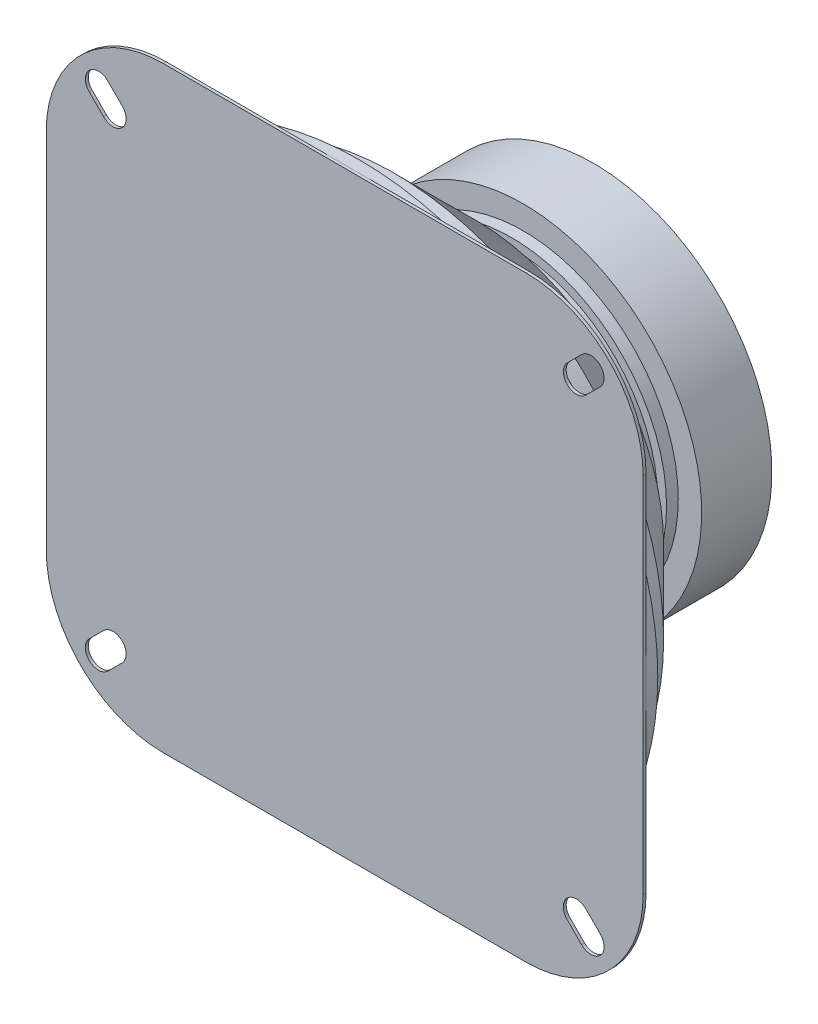
ISO-10303-21;
HEADER;
FILE_DESCRIPTION(('STEP AP214'),'2;1');
FILE_NAME('part.step','',(''),(''),'','','');
FILE_SCHEMA(('AUTOMOTIVE_DESIGN { 1 0 10303 214 1 1 1 1 }'));
ENDSEC;
DATA;
#1=APPLICATION_CONTEXT('core data for automotive mechanical design processes');
#2=APPLICATION_PROTOCOL_DEFINITION('international standard','automotive_design',2000,#1);
#3=PRODUCT_CONTEXT('',#1,'mechanical');
#4=PRODUCT('Part','Part','',(#3));
#5=PRODUCT_RELATED_PRODUCT_CATEGORY('part','',(#4));
#6=PRODUCT_DEFINITION_FORMATION('','',#4);
#7=PRODUCT_DEFINITION_CONTEXT('part definition',#1,'design');
#8=PRODUCT_DEFINITION('design','',#6,#7);
#9=PRODUCT_DEFINITION_SHAPE('','',#8);
#10=(LENGTH_UNIT() NAMED_UNIT(*) SI_UNIT(.MILLI.,.METRE.));
#11=(NAMED_UNIT(*) PLANE_ANGLE_UNIT() SI_UNIT($,.RADIAN.));
#12=(NAMED_UNIT(*) SI_UNIT($,.STERADIAN.) SOLID_ANGLE_UNIT());
#13=UNCERTAINTY_MEASURE_WITH_UNIT(LENGTH_MEASURE(1.E-05),#10,'distance_accuracy_value','');
#14=(GEOMETRIC_REPRESENTATION_CONTEXT(3) GLOBAL_UNCERTAINTY_ASSIGNED_CONTEXT((#13)) GLOBAL_UNIT_ASSIGNED_CONTEXT((#10,
#11,#12)) REPRESENTATION_CONTEXT('',''));
#15=CARTESIAN_POINT('',(0.,0.,0.));
#16=DIRECTION('',(0.,0.,1.));
#17=DIRECTION('',(1.,0.,0.));
#18=AXIS2_PLACEMENT_3D('',#15,#16,#17);
#19=CARTESIAN_POINT('',(0.,0.,14.));
#20=DIRECTION('',(0.,0.,-1.));
#21=DIRECTION('',(-1.,0.,0.));
#22=AXIS2_PLACEMENT_3D('',#19,#20,#21);
#23=CYLINDRICAL_SURFACE('',#22,30.5);
#24=CARTESIAN_POINT('',(0.,0.,14.));
#25=DIRECTION('',(0.,0.,-1.));
#26=DIRECTION('',(-1.,0.,0.));
#27=AXIS2_PLACEMENT_3D('',#24,#25,#26);
#28=CIRCLE('',#27,30.5);
#29=CARTESIAN_POINT('',(-30.5,0.,14.));
#30=VERTEX_POINT('',#29);
#31=EDGE_CURVE('E11',#30,#30,#28,.T.);
#32=ORIENTED_EDGE('',*,*,#31,.T.);
#33=EDGE_LOOP('',(#32));
#34=FACE_BOUND('',#33,.T.);
#35=CARTESIAN_POINT('',(0.,0.,2.));
#36=DIRECTION('',(0.,0.,-1.));
#37=DIRECTION('',(-1.,0.,0.));
#38=AXIS2_PLACEMENT_3D('',#35,#36,#37);
#39=CIRCLE('',#38,30.5);
#40=CARTESIAN_POINT('',(-30.5,0.,2.));
#41=VERTEX_POINT('',#40);
#42=EDGE_CURVE('E51',#41,#41,#39,.T.);
#43=ORIENTED_EDGE('',*,*,#42,.F.);
#44=EDGE_LOOP('',(#43));
#45=FACE_BOUND('',#44,.T.);
#46=ADVANCED_FACE('F45',(#34,#45),#23,.T.);
#47=CARTESIAN_POINT('',(0.,0.,14.));
#48=DIRECTION('',(0.,0.,-1.));
#49=DIRECTION('',(-1.,0.,0.));
#50=AXIS2_PLACEMENT_3D('',#47,#48,#49);
#51=PLANE('',#50);
#52=ORIENTED_EDGE('',*,*,#31,.F.);
#53=EDGE_LOOP('',(#52));
#54=FACE_BOUND('',#53,.T.);
#55=ADVANCED_FACE('F76',(#54),#51,.F.);
#56=CARTESIAN_POINT('',(0.,0.,2.));
#57=DIRECTION('',(0.,0.,-1.));
#58=DIRECTION('',(-1.,0.,0.));
#59=AXIS2_PLACEMENT_3D('',#56,#57,#58);
#60=PLANE('',#59);
#61=CARTESIAN_POINT('',(0.,0.,2.));
#62=DIRECTION('',(0.,0.,-1.));
#63=DIRECTION('',(-1.,0.,0.));
#64=AXIS2_PLACEMENT_3D('',#61,#62,#63);
#65=CIRCLE('',#64,26.5);
#66=CARTESIAN_POINT('',(-26.5,0.,2.));
#67=VERTEX_POINT('',#66);
#68=EDGE_CURVE('E55',#67,#67,#65,.T.);
#69=ORIENTED_EDGE('',*,*,#68,.F.);
#70=EDGE_LOOP('',(#69));
#71=FACE_BOUND('',#70,.T.);
#72=ORIENTED_EDGE('',*,*,#42,.T.);
#73=EDGE_LOOP('',(#72));
#74=FACE_BOUND('',#73,.T.);
#75=ADVANCED_FACE('F69',(#71,#74),#60,.T.);
#76=CARTESIAN_POINT('',(0.,0.,2.));
#77=DIRECTION('',(0.,0.,-1.));
#78=DIRECTION('',(-1.,0.,0.));
#79=AXIS2_PLACEMENT_3D('',#76,#77,#78);
#80=CYLINDRICAL_SURFACE('',#79,26.5);
#81=ORIENTED_EDGE('',*,*,#68,.T.);
#82=EDGE_LOOP('',(#81));
#83=FACE_BOUND('',#82,.T.);
#84=CARTESIAN_POINT('',(0.,0.,0.));
#85=DIRECTION('',(0.,0.,-1.));
#86=DIRECTION('',(-1.,0.,0.));
#87=AXIS2_PLACEMENT_3D('',#84,#85,#86);
#88=CIRCLE('',#87,26.5);
#89=CARTESIAN_POINT('',(-26.5,0.,0.));
#90=VERTEX_POINT('',#89);
#91=EDGE_CURVE('E59',#90,#90,#88,.T.);
#92=ORIENTED_EDGE('',*,*,#91,.F.);
#93=EDGE_LOOP('',(#92));
#94=FACE_BOUND('',#93,.T.);
#95=ADVANCED_FACE('F67',(#83,#94),#80,.T.);
#96=CARTESIAN_POINT('',(0.,0.,0.));
#97=DIRECTION('',(0.,0.,-1.));
#98=DIRECTION('',(-1.,0.,0.));
#99=AXIS2_PLACEMENT_3D('',#96,#97,#98);
#100=PLANE('',#99);
#101=ORIENTED_EDGE('',*,*,#91,.T.);
#102=EDGE_LOOP('',(#101));
#103=FACE_BOUND('',#102,.T.);
#104=ADVANCED_FACE('F65',(#103),#100,.T.);
#105=CLOSED_SHELL('',(#46,#55,#75,#95,#104));
#106=MANIFOLD_SOLID_BREP('B2',#105);
#107=CARTESIAN_POINT('',(0.,0.,16.));
#108=DIRECTION('',(0.,0.,-1.));
#109=DIRECTION('',(-1.,0.,0.));
#110=AXIS2_PLACEMENT_3D('',#107,#108,#109);
#111=CYLINDRICAL_SURFACE('',#110,26.5);
#112=CARTESIAN_POINT('',(0.,0.,0.));
#113=DIRECTION('',(0.,0.,1.));
#114=DIRECTION('',(1.,0.,0.));
#115=AXIS2_PLACEMENT_3D('',#112,#113,#114);
#116=CIRCLE('',#115,26.5);
#117=CARTESIAN_POINT('',(26.5,0.,0.));
#118=VERTEX_POINT('',#117);
#119=EDGE_CURVE('E515',#118,#118,#116,.T.);
#120=ORIENTED_EDGE('',*,*,#119,.T.);
#121=EDGE_LOOP('',(#120));
#122=FACE_BOUND('',#121,.T.);
#123=CARTESIAN_POINT('',(0.,0.,16.));
#124=DIRECTION('',(0.,0.,1.));
#125=DIRECTION('',(1.,0.,0.));
#126=AXIS2_PLACEMENT_3D('',#123,#124,#125);
#127=CIRCLE('',#126,26.5);
#128=CARTESIAN_POINT('',(26.5,0.,16.));
#129=VERTEX_POINT('',#128);
#130=EDGE_CURVE('E130',#129,#129,#127,.T.);
#131=ORIENTED_EDGE('',*,*,#130,.F.);
#132=EDGE_LOOP('',(#131));
#133=FACE_BOUND('',#132,.T.);
#134=ADVANCED_FACE('F122',(#122,#133),#111,.T.);
#135=CARTESIAN_POINT('',(0.,0.,16.));
#136=DIRECTION('',(0.,0.,1.));
#137=DIRECTION('',(1.,0.,0.));
#138=AXIS2_PLACEMENT_3D('',#135,#136,#137);
#139=PLANE('',#138);
#140=CARTESIAN_POINT('',(0.,0.,16.));
#141=DIRECTION('',(0.,0.,1.));
#142=DIRECTION('',(1.,0.,0.));
#143=AXIS2_PLACEMENT_3D('',#140,#141,#142);
#144=CIRCLE('',#143,25.);
#145=CARTESIAN_POINT('',(25.,0.,16.));
#146=VERTEX_POINT('',#145);
#147=EDGE_CURVE('E511',#146,#146,#144,.T.);
#148=ORIENTED_EDGE('',*,*,#147,.F.);
#149=EDGE_LOOP('',(#148));
#150=FACE_BOUND('',#149,.T.);
#151=ORIENTED_EDGE('',*,*,#130,.T.);
#152=EDGE_LOOP('',(#151));
#153=FACE_BOUND('',#152,.T.);
#154=ADVANCED_FACE('F527',(#150,#153),#139,.T.);
#155=CARTESIAN_POINT('',(0.,0.,0.));
#156=DIRECTION('',(0.,0.,1.));
#157=DIRECTION('',(1.,0.,0.));
#158=AXIS2_PLACEMENT_3D('',#155,#156,#157);
#159=PLANE('',#158);
#160=ORIENTED_EDGE('',*,*,#119,.F.);
#161=EDGE_LOOP('',(#160));
#162=FACE_BOUND('',#161,.T.);
#163=ADVANCED_FACE('F524',(#162),#159,.F.);
#164=CARTESIAN_POINT('',(0.,0.,22.));
#165=DIRECTION('',(0.,0.,-1.));
#166=DIRECTION('',(-1.,0.,0.));
#167=AXIS2_PLACEMENT_3D('',#164,#165,#166);
#168=CYLINDRICAL_SURFACE('',#167,25.);
#169=CARTESIAN_POINT('',(0.,0.,22.));
#170=DIRECTION('',(0.,0.,1.));
#171=DIRECTION('',(1.,0.,0.));
#172=AXIS2_PLACEMENT_3D('',#169,#170,#171);
#173=CIRCLE('',#172,25.);
#174=CARTESIAN_POINT('',(25.,0.,22.));
#175=VERTEX_POINT('',#174);
#176=EDGE_CURVE('E512',#175,#175,#173,.T.);
#177=ORIENTED_EDGE('',*,*,#176,.F.);
#178=EDGE_LOOP('',(#177));
#179=FACE_BOUND('',#178,.T.);
#180=ORIENTED_EDGE('',*,*,#147,.T.);
#181=EDGE_LOOP('',(#180));
#182=FACE_BOUND('',#181,.T.);
#183=ADVANCED_FACE('F526',(#179,#182),#168,.T.);
#184=CARTESIAN_POINT('',(0.,0.,22.));
#185=DIRECTION('',(0.,0.,1.));
#186=DIRECTION('',(1.,0.,0.));
#187=AXIS2_PLACEMENT_3D('',#184,#185,#186);
#188=PLANE('',#187);
#189=CARTESIAN_POINT('',(0.,0.,22.));
#190=DIRECTION('',(0.,0.,1.));
#191=DIRECTION('',(1.,0.,0.));
#192=AXIS2_PLACEMENT_3D('',#189,#190,#191);
#193=CIRCLE('',#192,32.);
#194=CARTESIAN_POINT('',(32.,0.,22.));
#195=VERTEX_POINT('',#194);
#196=EDGE_CURVE('E43',#195,#195,#193,.F.);
#197=ORIENTED_EDGE('',*,*,#196,.T.);
#198=EDGE_LOOP('',(#197));
#199=FACE_BOUND('',#198,.T.);
#200=ORIENTED_EDGE('',*,*,#176,.T.);
#201=EDGE_LOOP('',(#200));
#202=FACE_BOUND('',#201,.T.);
#203=ADVANCED_FACE('F533',(#199,#202),#188,.F.);
#204=CARTESIAN_POINT('',(0.,0.,36.));
#205=DIRECTION('',(0.,0.,1.));
#206=DIRECTION('',(1.,0.,0.));
#207=AXIS2_PLACEMENT_3D('',#204,#205,#206);
#208=CONICAL_SURFACE('',#207,46.,0.78539816339745);
#209=ORIENTED_EDGE('',*,*,#196,.F.);
#210=EDGE_LOOP('',(#209));
#211=FACE_BOUND('',#210,.T.);
#212=CARTESIAN_POINT('',(0.,0.,36.));
#213=DIRECTION('',(0.,0.,1.));
#214=DIRECTION('',(1.,0.,0.));
#215=AXIS2_PLACEMENT_3D('',#212,#213,#214);
#216=CIRCLE('',#215,46.);
#217=CARTESIAN_POINT('',(46.,0.,36.));
#218=VERTEX_POINT('',#217);
#219=EDGE_CURVE('E508',#218,#218,#216,.T.);
#220=ORIENTED_EDGE('',*,*,#219,.F.);
#221=EDGE_LOOP('',(#220));
#222=FACE_BOUND('',#221,.T.);
#223=ADVANCED_FACE('F124',(#211,#222),#208,.T.);
#224=CARTESIAN_POINT('',(0.,0.,42.));
#225=DIRECTION('',(0.,0.,-1.));
#226=DIRECTION('',(-1.,0.,0.));
#227=AXIS2_PLACEMENT_3D('',#224,#225,#226);
#228=CYLINDRICAL_SURFACE('',#227,46.);
#229=CARTESIAN_POINT('',(0.,0.,42.));
#230=DIRECTION('',(0.,0.,1.));
#231=DIRECTION('',(1.,0.,0.));
#232=AXIS2_PLACEMENT_3D('',#229,#230,#231);
#233=CIRCLE('',#232,46.);
#234=CARTESIAN_POINT('',(46.,0.,42.));
#235=VERTEX_POINT('',#234);
#236=EDGE_CURVE('E502',#235,#235,#233,.T.);
#237=ORIENTED_EDGE('',*,*,#236,.F.);
#238=EDGE_LOOP('',(#237));
#239=FACE_BOUND('',#238,.T.);
#240=ORIENTED_EDGE('',*,*,#219,.T.);
#241=EDGE_LOOP('',(#240));
#242=FACE_BOUND('',#241,.T.);
#243=ADVANCED_FACE('F571',(#239,#242),#228,.T.);
#244=CARTESIAN_POINT('',(0.,0.,44.));
#245=DIRECTION('',(0.,0.,-1.));
#246=DIRECTION('',(-1.,0.,0.));
#247=AXIS2_PLACEMENT_3D('',#244,#245,#246);
#248=CYLINDRICAL_SURFACE('',#247,51.);
#249=CARTESIAN_POINT('',(0.,0.,44.));
#250=DIRECTION('',(0.,0.,1.));
#251=DIRECTION('',(1.,0.,0.));
#252=AXIS2_PLACEMENT_3D('',#249,#250,#251);
#253=CIRCLE('',#252,51.);
#254=CARTESIAN_POINT('',(51.,0.,44.));
#255=VERTEX_POINT('',#254);
#256=CARTESIAN_POINT('',(0.,51.,44.));
#257=VERTEX_POINT('',#256);
#258=EDGE_CURVE('E499',#255,#257,#253,.T.);
#259=ORIENTED_EDGE('',*,*,#258,.F.);
#260=CARTESIAN_POINT('',(0.,-51.,44.));
#261=VERTEX_POINT('',#260);
#262=EDGE_CURVE('E137',#261,#255,#253,.T.);
#263=ORIENTED_EDGE('',*,*,#262,.F.);
#264=CARTESIAN_POINT('',(-51.,0.,44.));
#265=VERTEX_POINT('',#264);
#266=EDGE_CURVE('E141',#265,#261,#253,.T.);
#267=ORIENTED_EDGE('',*,*,#266,.F.);
#268=EDGE_CURVE('E503',#257,#265,#253,.T.);
#269=ORIENTED_EDGE('',*,*,#268,.F.);
#270=EDGE_LOOP('',(#259,#263,#267,#269));
#271=FACE_BOUND('',#270,.T.);
#272=CARTESIAN_POINT('',(0.,0.,42.));
#273=DIRECTION('',(0.,0.,1.));
#274=DIRECTION('',(1.,0.,0.));
#275=AXIS2_PLACEMENT_3D('',#272,#273,#274);
#276=CIRCLE('',#275,51.);
#277=CARTESIAN_POINT('',(51.,0.,42.));
#278=VERTEX_POINT('',#277);
#279=EDGE_CURVE('E461',#278,#278,#276,.T.);
#280=ORIENTED_EDGE('',*,*,#279,.T.);
#281=EDGE_LOOP('',(#280));
#282=FACE_BOUND('',#281,.T.);
#283=ADVANCED_FACE('F580',(#271,#282),#248,.T.);
#284=CARTESIAN_POINT('',(0.,0.,42.));
#285=DIRECTION('',(0.,0.,1.));
#286=DIRECTION('',(1.,0.,0.));
#287=AXIS2_PLACEMENT_3D('',#284,#285,#286);
#288=PLANE('',#287);
#289=ORIENTED_EDGE('',*,*,#236,.T.);
#290=EDGE_LOOP('',(#289));
#291=FACE_BOUND('',#290,.T.);
#292=ORIENTED_EDGE('',*,*,#279,.F.);
#293=EDGE_LOOP('',(#292));
#294=FACE_BOUND('',#293,.T.);
#295=ADVANCED_FACE('F588',(#291,#294),#288,.F.);
#296=CARTESIAN_POINT('',(0.,0.,44.));
#297=DIRECTION('',(0.,0.,1.));
#298=DIRECTION('',(1.,0.,0.));
#299=AXIS2_PLACEMENT_3D('',#296,#297,#298);
#300=PLANE('',#299);
#301=DIRECTION('',(0.707106781186548,0.707106781186548,0.));
#302=VECTOR('',#301,1.);
#303=CARTESIAN_POINT('',(1.59099025766973,-1.59099025766973,44.));
#304=LINE('',#303,#302);
#305=CARTESIAN_POINT('',(41.1889700041164,38.0069894887769,44.));
#306=VERTEX_POINT('',#305);
#307=CARTESIAN_POINT('',(43.6638437382693,40.4818632229298,44.));
#308=VERTEX_POINT('',#307);
#309=EDGE_CURVE('E408',#306,#308,#304,.T.);
#310=ORIENTED_EDGE('',*,*,#309,.T.);
#311=CARTESIAN_POINT('',(42.0728534805996,42.0728534805996,44.));
#312=DIRECTION('',(0.,0.,1.));
#313=DIRECTION('',(1.,0.,0.));
#314=AXIS2_PLACEMENT_3D('',#311,#312,#313);
#315=CIRCLE('',#314,2.24999999999999);
#316=CARTESIAN_POINT('',(40.4818632229298,43.6638437382693,44.));
#317=VERTEX_POINT('',#316);
#318=EDGE_CURVE('E417',#308,#317,#315,.T.);
#319=ORIENTED_EDGE('',*,*,#318,.T.);
#320=DIRECTION('',(0.707106781186548,0.707106781186548,0.));
#321=VECTOR('',#320,1.);
#322=CARTESIAN_POINT('',(-1.59099025766973,1.59099025766973,44.));
#323=LINE('',#322,#321);
#324=CARTESIAN_POINT('',(38.0069894887769,41.1889700041164,44.));
#325=VERTEX_POINT('',#324);
#326=EDGE_CURVE('E414',#325,#317,#323,.T.);
#327=ORIENTED_EDGE('',*,*,#326,.F.);
#328=CARTESIAN_POINT('',(39.5979797464467,39.5979797464467,44.));
#329=DIRECTION('',(0.,0.,1.));
#330=DIRECTION('',(1.,0.,0.));
#331=AXIS2_PLACEMENT_3D('',#328,#329,#330);
#332=CIRCLE('',#331,2.24999999999999);
#333=EDGE_CURVE('E411',#325,#306,#332,.T.);
#334=ORIENTED_EDGE('',*,*,#333,.T.);
#335=EDGE_LOOP('',(#310,#319,#327,#334));
#336=FACE_BOUND('',#335,.T.);
#337=DIRECTION('',(0.,-1.,0.));
#338=VECTOR('',#337,1.);
#339=CARTESIAN_POINT('',(51.,0.,44.));
#340=LINE('',#339,#338);
#341=CARTESIAN_POINT('',(51.,30.9999999999998,44.));
#342=VERTEX_POINT('',#341);
#343=EDGE_CURVE('E301',#342,#255,#340,.T.);
#344=ORIENTED_EDGE('',*,*,#343,.T.);
#345=ORIENTED_EDGE('',*,*,#258,.T.);
#346=DIRECTION('',(1.,0.,0.));
#347=VECTOR('',#346,1.);
#348=CARTESIAN_POINT('',(0.,51.,44.));
#349=LINE('',#348,#347);
#350=CARTESIAN_POINT('',(30.9999999999999,51.,44.));
#351=VERTEX_POINT('',#350);
#352=EDGE_CURVE('E388',#257,#351,#349,.T.);
#353=ORIENTED_EDGE('',*,*,#352,.T.);
#354=CARTESIAN_POINT('',(31.,31.,44.));
#355=DIRECTION('',(0.,0.,1.));
#356=DIRECTION('',(1.,0.,0.));
#357=AXIS2_PLACEMENT_3D('',#354,#355,#356);
#358=CIRCLE('',#357,20.);
#359=EDGE_CURVE('E385',#342,#351,#358,.T.);
#360=ORIENTED_EDGE('',*,*,#359,.F.);
#361=EDGE_LOOP('',(#344,#345,#353,#360));
#362=FACE_BOUND('',#361,.T.);
#363=ADVANCED_FACE('F593',(#336,#362),#300,.F.);
#364=CARTESIAN_POINT('',(-42.0728534805996,42.0728534805996,44.));
#365=DIRECTION('',(0.,0.,1.));
#366=DIRECTION('',(1.,0.,0.));
#367=AXIS2_PLACEMENT_3D('',#364,#365,#366);
#368=CIRCLE('',#367,2.25);
#369=CARTESIAN_POINT('',(-40.4818632229298,43.6638437382693,44.));
#370=VERTEX_POINT('',#369);
#371=CARTESIAN_POINT('',(-43.6638437382693,40.4818632229298,44.));
#372=VERTEX_POINT('',#371);
#373=EDGE_CURVE('E432',#370,#372,#368,.T.);
#374=ORIENTED_EDGE('',*,*,#373,.T.);
#375=DIRECTION('',(-0.707106781186548,0.707106781186548,0.));
#376=VECTOR('',#375,1.);
#377=CARTESIAN_POINT('',(-1.59099025766973,-1.59099025766973,44.));
#378=LINE('',#377,#376);
#379=CARTESIAN_POINT('',(-41.1889700041164,38.0069894887769,44.));
#380=VERTEX_POINT('',#379);
#381=EDGE_CURVE('E441',#380,#372,#378,.T.);
#382=ORIENTED_EDGE('',*,*,#381,.F.);
#383=CARTESIAN_POINT('',(-39.5979797464467,39.5979797464467,44.));
#384=DIRECTION('',(0.,0.,1.));
#385=DIRECTION('',(1.,0.,0.));
#386=AXIS2_PLACEMENT_3D('',#383,#384,#385);
#387=CIRCLE('',#386,2.25);
#388=CARTESIAN_POINT('',(-38.0069894887769,41.1889700041164,44.));
#389=VERTEX_POINT('',#388);
#390=EDGE_CURVE('E438',#380,#389,#387,.T.);
#391=ORIENTED_EDGE('',*,*,#390,.T.);
#392=DIRECTION('',(-0.707106781186548,0.707106781186548,0.));
#393=VECTOR('',#392,1.);
#394=CARTESIAN_POINT('',(1.59099025766973,1.59099025766973,44.));
#395=LINE('',#394,#393);
#396=EDGE_CURVE('E435',#389,#370,#395,.T.);
#397=ORIENTED_EDGE('',*,*,#396,.T.);
#398=EDGE_LOOP('',(#374,#382,#391,#397));
#399=FACE_BOUND('',#398,.T.);
#400=CARTESIAN_POINT('',(-30.9999999999999,51.,44.));
#401=VERTEX_POINT('',#400);
#402=EDGE_CURVE('E389',#401,#257,#349,.T.);
#403=ORIENTED_EDGE('',*,*,#402,.T.);
#404=ORIENTED_EDGE('',*,*,#268,.T.);
#405=DIRECTION('',(0.,-1.,0.));
#406=VECTOR('',#405,1.);
#407=CARTESIAN_POINT('',(-51.,0.,44.));
#408=LINE('',#407,#406);
#409=CARTESIAN_POINT('',(-51.,30.9999999999999,44.));
#410=VERTEX_POINT('',#409);
#411=EDGE_CURVE('E395',#410,#265,#408,.T.);
#412=ORIENTED_EDGE('',*,*,#411,.F.);
#413=CARTESIAN_POINT('',(-31.,31.,44.));
#414=DIRECTION('',(0.,0.,1.));
#415=DIRECTION('',(1.,0.,0.));
#416=AXIS2_PLACEMENT_3D('',#413,#414,#415);
#417=CIRCLE('',#416,20.);
#418=EDGE_CURVE('E392',#401,#410,#417,.T.);
#419=ORIENTED_EDGE('',*,*,#418,.F.);
#420=EDGE_LOOP('',(#403,#404,#412,#419));
#421=FACE_BOUND('',#420,.T.);
#422=ADVANCED_FACE('F610',(#399,#421),#300,.F.);
#423=CARTESIAN_POINT('',(-39.5979797464467,-39.5979797464467,44.));
#424=DIRECTION('',(0.,0.,1.));
#425=DIRECTION('',(1.,0.,0.));
#426=AXIS2_PLACEMENT_3D('',#423,#424,#425);
#427=CIRCLE('',#426,2.25000000000001);
#428=CARTESIAN_POINT('',(-38.0069894887769,-41.1889700041164,44.));
#429=VERTEX_POINT('',#428);
#430=CARTESIAN_POINT('',(-41.1889700041164,-38.0069894887769,44.));
#431=VERTEX_POINT('',#430);
#432=EDGE_CURVE('E444',#429,#431,#427,.T.);
#433=ORIENTED_EDGE('',*,*,#432,.T.);
#434=DIRECTION('',(0.707106781186546,0.707106781186549,0.));
#435=VECTOR('',#434,1.);
#436=CARTESIAN_POINT('',(-1.59099025766985,1.59099025766984,44.));
#437=LINE('',#436,#435);
#438=CARTESIAN_POINT('',(-43.6638437382693,-40.4818632229298,44.));
#439=VERTEX_POINT('',#438);
#440=EDGE_CURVE('E322',#439,#431,#437,.T.);
#441=ORIENTED_EDGE('',*,*,#440,.F.);
#442=CARTESIAN_POINT('',(-42.0728534805996,-42.0728534805996,44.));
#443=DIRECTION('',(0.,0.,1.));
#444=DIRECTION('',(1.,0.,0.));
#445=AXIS2_PLACEMENT_3D('',#442,#443,#444);
#446=CIRCLE('',#445,2.25);
#447=CARTESIAN_POINT('',(-40.4818632229298,-43.6638437382693,44.));
#448=VERTEX_POINT('',#447);
#449=EDGE_CURVE('E325',#439,#448,#446,.T.);
#450=ORIENTED_EDGE('',*,*,#449,.T.);
#451=DIRECTION('',(0.707106781186549,0.707106781186546,0.));
#452=VECTOR('',#451,1.);
#453=CARTESIAN_POINT('',(1.59099025766984,-1.59099025766985,44.));
#454=LINE('',#453,#452);
#455=EDGE_CURVE('E447',#448,#429,#454,.T.);
#456=ORIENTED_EDGE('',*,*,#455,.T.);
#457=EDGE_LOOP('',(#433,#441,#450,#456));
#458=FACE_BOUND('',#457,.T.);
#459=CARTESIAN_POINT('',(-51.,-30.9999999999999,44.));
#460=VERTEX_POINT('',#459);
#461=EDGE_CURVE('E394',#265,#460,#408,.T.);
#462=ORIENTED_EDGE('',*,*,#461,.F.);
#463=ORIENTED_EDGE('',*,*,#266,.T.);
#464=DIRECTION('',(1.,0.,0.));
#465=VECTOR('',#464,1.);
#466=CARTESIAN_POINT('',(0.,-51.,44.));
#467=LINE('',#466,#465);
#468=CARTESIAN_POINT('',(-30.9999999999999,-51.,44.));
#469=VERTEX_POINT('',#468);
#470=EDGE_CURVE('E402',#469,#261,#467,.T.);
#471=ORIENTED_EDGE('',*,*,#470,.F.);
#472=CARTESIAN_POINT('',(-31.,-31.,44.));
#473=DIRECTION('',(0.,0.,1.));
#474=DIRECTION('',(1.,0.,0.));
#475=AXIS2_PLACEMENT_3D('',#472,#473,#474);
#476=CIRCLE('',#475,20.);
#477=EDGE_CURVE('E398',#469,#460,#476,.F.);
#478=ORIENTED_EDGE('',*,*,#477,.T.);
#479=EDGE_LOOP('',(#462,#463,#471,#478));
#480=FACE_BOUND('',#479,.T.);
#481=ADVANCED_FACE('F623',(#458,#480),#300,.F.);
#482=DIRECTION('',(0.707106781186548,-0.707106781186548,0.));
#483=VECTOR('',#482,1.);
#484=CARTESIAN_POINT('',(1.59099025766973,1.59099025766973,44.));
#485=LINE('',#484,#483);
#486=CARTESIAN_POINT('',(41.1889700041164,-38.0069894887769,44.));
#487=VERTEX_POINT('',#486);
#488=CARTESIAN_POINT('',(43.6638437382693,-40.4818632229298,44.));
#489=VERTEX_POINT('',#488);
#490=EDGE_CURVE('E420',#487,#489,#485,.T.);
#491=ORIENTED_EDGE('',*,*,#490,.F.);
#492=CARTESIAN_POINT('',(39.5979797464467,-39.5979797464467,44.));
#493=DIRECTION('',(0.,0.,1.));
#494=DIRECTION('',(1.,0.,0.));
#495=AXIS2_PLACEMENT_3D('',#492,#493,#494);
#496=CIRCLE('',#495,2.24999999999999);
#497=CARTESIAN_POINT('',(38.0069894887769,-41.1889700041164,44.));
#498=VERTEX_POINT('',#497);
#499=EDGE_CURVE('E429',#487,#498,#496,.T.);
#500=ORIENTED_EDGE('',*,*,#499,.T.);
#501=DIRECTION('',(0.707106781186548,-0.707106781186548,0.));
#502=VECTOR('',#501,1.);
#503=CARTESIAN_POINT('',(-1.59099025766971,-1.59099025766971,44.));
#504=LINE('',#503,#502);
#505=CARTESIAN_POINT('',(40.4818632229299,-43.6638437382693,44.));
#506=VERTEX_POINT('',#505);
#507=EDGE_CURVE('E426',#498,#506,#504,.T.);
#508=ORIENTED_EDGE('',*,*,#507,.T.);
#509=CARTESIAN_POINT('',(42.0728534805996,-42.0728534805996,44.));
#510=DIRECTION('',(0.,0.,1.));
#511=DIRECTION('',(1.,0.,0.));
#512=AXIS2_PLACEMENT_3D('',#509,#510,#511);
#513=CIRCLE('',#512,2.24999999999999);
#514=EDGE_CURVE('E423',#506,#489,#513,.T.);
#515=ORIENTED_EDGE('',*,*,#514,.T.);
#516=EDGE_LOOP('',(#491,#500,#508,#515));
#517=FACE_BOUND('',#516,.T.);
#518=CARTESIAN_POINT('',(30.9999999999999,-51.,44.));
#519=VERTEX_POINT('',#518);
#520=EDGE_CURVE('E401',#261,#519,#467,.T.);
#521=ORIENTED_EDGE('',*,*,#520,.F.);
#522=ORIENTED_EDGE('',*,*,#262,.T.);
#523=CARTESIAN_POINT('',(51.,-30.9999999999998,44.));
#524=VERTEX_POINT('',#523);
#525=EDGE_CURVE('E386',#255,#524,#340,.T.);
#526=ORIENTED_EDGE('',*,*,#525,.T.);
#527=CARTESIAN_POINT('',(31.,-31.,44.));
#528=DIRECTION('',(0.,0.,1.));
#529=DIRECTION('',(1.,0.,0.));
#530=AXIS2_PLACEMENT_3D('',#527,#528,#529);
#531=CIRCLE('',#530,20.);
#532=EDGE_CURVE('E405',#519,#524,#531,.T.);
#533=ORIENTED_EDGE('',*,*,#532,.F.);
#534=EDGE_LOOP('',(#521,#522,#526,#533));
#535=FACE_BOUND('',#534,.T.);
#536=ADVANCED_FACE('F613',(#517,#535),#300,.F.);
#537=CARTESIAN_POINT('',(-39.5979797464467,-39.5979797464467,44.5));
#538=DIRECTION('',(0.,0.,-1.));
#539=DIRECTION('',(-1.,0.,0.));
#540=AXIS2_PLACEMENT_3D('',#537,#538,#539);
#541=CYLINDRICAL_SURFACE('',#540,2.25000000000001);
#542=ORIENTED_EDGE('',*,*,#432,.F.);
#543=DIRECTION('',(0.,0.,-1.));
#544=VECTOR('',#543,1.);
#545=CARTESIAN_POINT('',(-38.0069894887769,-41.1889700041164,44.5));
#546=LINE('',#545,#544);
#547=CARTESIAN_POINT('',(-38.0069894887769,-41.1889700041164,44.5));
#548=VERTEX_POINT('',#547);
#549=EDGE_CURVE('E459',#548,#429,#546,.T.);
#550=ORIENTED_EDGE('',*,*,#549,.F.);
#551=CARTESIAN_POINT('',(-39.5979797464467,-39.5979797464467,44.5));
#552=DIRECTION('',(0.,0.,1.));
#553=DIRECTION('',(1.,0.,0.));
#554=AXIS2_PLACEMENT_3D('',#551,#552,#553);
#555=CIRCLE('',#554,2.25000000000001);
#556=CARTESIAN_POINT('',(-41.1889700041164,-38.0069894887769,44.5));
#557=VERTEX_POINT('',#556);
#558=EDGE_CURVE('E372',#548,#557,#555,.T.);
#559=ORIENTED_EDGE('',*,*,#558,.T.);
#560=DIRECTION('',(0.,0.,-1.));
#561=VECTOR('',#560,1.);
#562=CARTESIAN_POINT('',(-41.1889700041164,-38.0069894887769,44.5));
#563=LINE('',#562,#561);
#564=EDGE_CURVE('E452',#557,#431,#563,.T.);
#565=ORIENTED_EDGE('',*,*,#564,.T.);
#566=EDGE_LOOP('',(#542,#550,#559,#565));
#567=FACE_BOUND('',#566,.T.);
#568=ADVANCED_FACE('F644',(#567),#541,.F.);
#569=CARTESIAN_POINT('',(1.59099025766984,-1.59099025766985,44.5));
#570=DIRECTION('',(-0.707106781186546,0.707106781186549,0.));
#571=DIRECTION('',(-0.707106781186549,-0.707106781186546,0.));
#572=AXIS2_PLACEMENT_3D('',#569,#570,#571);
#573=PLANE('',#572);
#574=ORIENTED_EDGE('',*,*,#455,.F.);
#575=DIRECTION('',(0.,0.,-1.));
#576=VECTOR('',#575,1.);
#577=CARTESIAN_POINT('',(-40.4818632229298,-43.6638437382693,44.5));
#578=LINE('',#577,#576);
#579=CARTESIAN_POINT('',(-40.4818632229298,-43.6638437382693,44.5));
#580=VERTEX_POINT('',#579);
#581=EDGE_CURVE('E457',#580,#448,#578,.T.);
#582=ORIENTED_EDGE('',*,*,#581,.F.);
#583=DIRECTION('',(0.707106781186549,0.707106781186546,0.));
#584=VECTOR('',#583,1.);
#585=CARTESIAN_POINT('',(1.59099025766984,-1.59099025766985,44.5));
#586=LINE('',#585,#584);
#587=EDGE_CURVE('E375',#580,#548,#586,.T.);
#588=ORIENTED_EDGE('',*,*,#587,.T.);
#589=ORIENTED_EDGE('',*,*,#549,.T.);
#590=EDGE_LOOP('',(#574,#582,#588,#589));
#591=FACE_BOUND('',#590,.T.);
#592=ADVANCED_FACE('F654',(#591),#573,.T.);
#593=CARTESIAN_POINT('',(-42.0728534805996,-42.0728534805996,44.5));
#594=DIRECTION('',(0.,0.,-1.));
#595=DIRECTION('',(-1.,0.,0.));
#596=AXIS2_PLACEMENT_3D('',#593,#594,#595);
#597=CYLINDRICAL_SURFACE('',#596,2.25);
#598=ORIENTED_EDGE('',*,*,#449,.F.);
#599=DIRECTION('',(0.,0.,-1.));
#600=VECTOR('',#599,1.);
#601=CARTESIAN_POINT('',(-43.6638437382693,-40.4818632229298,44.5));
#602=LINE('',#601,#600);
#603=CARTESIAN_POINT('',(-43.6638437382693,-40.4818632229298,44.5));
#604=VERTEX_POINT('',#603);
#605=EDGE_CURVE('E454',#604,#439,#602,.T.);
#606=ORIENTED_EDGE('',*,*,#605,.F.);
#607=CARTESIAN_POINT('',(-42.0728534805996,-42.0728534805996,44.5));
#608=DIRECTION('',(0.,0.,1.));
#609=DIRECTION('',(1.,0.,0.));
#610=AXIS2_PLACEMENT_3D('',#607,#608,#609);
#611=CIRCLE('',#610,2.25);
#612=EDGE_CURVE('E378',#604,#580,#611,.T.);
#613=ORIENTED_EDGE('',*,*,#612,.T.);
#614=ORIENTED_EDGE('',*,*,#581,.T.);
#615=EDGE_LOOP('',(#598,#606,#613,#614));
#616=FACE_BOUND('',#615,.T.);
#617=ADVANCED_FACE('F664',(#616),#597,.F.);
#618=CARTESIAN_POINT('',(-42.0728534805996,42.0728534805996,44.5));
#619=DIRECTION('',(0.,0.,-1.));
#620=DIRECTION('',(-1.,0.,0.));
#621=AXIS2_PLACEMENT_3D('',#618,#619,#620);
#622=CYLINDRICAL_SURFACE('',#621,2.25);
#623=ORIENTED_EDGE('',*,*,#373,.F.);
#624=DIRECTION('',(0.,0.,-1.));
#625=VECTOR('',#624,1.);
#626=CARTESIAN_POINT('',(-40.4818632229298,43.6638437382693,44.5));
#627=LINE('',#626,#625);
#628=CARTESIAN_POINT('',(-40.4818632229298,43.6638437382693,44.5));
#629=VERTEX_POINT('',#628);
#630=EDGE_CURVE('E455',#629,#370,#627,.T.);
#631=ORIENTED_EDGE('',*,*,#630,.F.);
#632=CARTESIAN_POINT('',(-42.0728534805996,42.0728534805996,44.5));
#633=DIRECTION('',(0.,0.,1.));
#634=DIRECTION('',(1.,0.,0.));
#635=AXIS2_PLACEMENT_3D('',#632,#633,#634);
#636=CIRCLE('',#635,2.25);
#637=CARTESIAN_POINT('',(-43.6638437382693,40.4818632229298,44.5));
#638=VERTEX_POINT('',#637);
#639=EDGE_CURVE('E361',#629,#638,#636,.T.);
#640=ORIENTED_EDGE('',*,*,#639,.T.);
#641=DIRECTION('',(0.,0.,-1.));
#642=VECTOR('',#641,1.);
#643=CARTESIAN_POINT('',(-43.6638437382693,40.4818632229298,44.5));
#644=LINE('',#643,#642);
#645=EDGE_CURVE('E462',#638,#372,#644,.T.);
#646=ORIENTED_EDGE('',*,*,#645,.T.);
#647=EDGE_LOOP('',(#623,#631,#640,#646));
#648=FACE_BOUND('',#647,.T.);
#649=ADVANCED_FACE('F674',(#648),#622,.F.);
#650=CARTESIAN_POINT('',(1.59099025766973,1.59099025766973,44.5));
#651=DIRECTION('',(-0.707106781186547,-0.707106781186547,0.));
#652=DIRECTION('',(0.707106781186548,-0.707106781186548,0.));
#653=AXIS2_PLACEMENT_3D('',#650,#651,#652);
#654=PLANE('',#653);
#655=ORIENTED_EDGE('',*,*,#396,.F.);
#656=DIRECTION('',(0.,0.,-1.));
#657=VECTOR('',#656,1.);
#658=CARTESIAN_POINT('',(-38.0069894887769,41.1889700041164,44.5));
#659=LINE('',#658,#657);
#660=CARTESIAN_POINT('',(-38.0069894887769,41.1889700041164,44.5));
#661=VERTEX_POINT('',#660);
#662=EDGE_CURVE('E467',#661,#389,#659,.T.);
#663=ORIENTED_EDGE('',*,*,#662,.F.);
#664=DIRECTION('',(-0.707106781186548,0.707106781186548,0.));
#665=VECTOR('',#664,1.);
#666=CARTESIAN_POINT('',(1.59099025766973,1.59099025766973,44.5));
#667=LINE('',#666,#665);
#668=EDGE_CURVE('E364',#661,#629,#667,.T.);
#669=ORIENTED_EDGE('',*,*,#668,.T.);
#670=ORIENTED_EDGE('',*,*,#630,.T.);
#671=EDGE_LOOP('',(#655,#663,#669,#670));
#672=FACE_BOUND('',#671,.T.);
#673=ADVANCED_FACE('F684',(#672),#654,.T.);
#674=CARTESIAN_POINT('',(-39.5979797464467,39.5979797464467,44.5));
#675=DIRECTION('',(0.,0.,-1.));
#676=DIRECTION('',(-1.,0.,0.));
#677=AXIS2_PLACEMENT_3D('',#674,#675,#676);
#678=CYLINDRICAL_SURFACE('',#677,2.25);
#679=ORIENTED_EDGE('',*,*,#390,.F.);
#680=DIRECTION('',(0.,0.,-1.));
#681=VECTOR('',#680,1.);
#682=CARTESIAN_POINT('',(-41.1889700041164,38.0069894887769,44.5));
#683=LINE('',#682,#681);
#684=CARTESIAN_POINT('',(-41.1889700041164,38.0069894887769,44.5));
#685=VERTEX_POINT('',#684);
#686=EDGE_CURVE('E464',#685,#380,#683,.T.);
#687=ORIENTED_EDGE('',*,*,#686,.F.);
#688=CARTESIAN_POINT('',(-39.5979797464467,39.5979797464467,44.5));
#689=DIRECTION('',(0.,0.,1.));
#690=DIRECTION('',(1.,0.,0.));
#691=AXIS2_PLACEMENT_3D('',#688,#689,#690);
#692=CIRCLE('',#691,2.25);
#693=EDGE_CURVE('E367',#685,#661,#692,.T.);
#694=ORIENTED_EDGE('',*,*,#693,.T.);
#695=ORIENTED_EDGE('',*,*,#662,.T.);
#696=EDGE_LOOP('',(#679,#687,#694,#695));
#697=FACE_BOUND('',#696,.T.);
#698=ADVANCED_FACE('F694',(#697),#678,.F.);
#699=CARTESIAN_POINT('',(1.59099025766973,1.59099025766973,44.5));
#700=DIRECTION('',(0.707106781186547,0.707106781186547,0.));
#701=DIRECTION('',(-0.707106781186548,0.707106781186548,0.));
#702=AXIS2_PLACEMENT_3D('',#699,#700,#701);
#703=PLANE('',#702);
#704=ORIENTED_EDGE('',*,*,#490,.T.);
#705=DIRECTION('',(0.,0.,-1.));
#706=VECTOR('',#705,1.);
#707=CARTESIAN_POINT('',(43.6638437382693,-40.4818632229298,44.5));
#708=LINE('',#707,#706);
#709=CARTESIAN_POINT('',(43.6638437382693,-40.4818632229298,44.5));
#710=VERTEX_POINT('',#709);
#711=EDGE_CURVE('E465',#710,#489,#708,.T.);
#712=ORIENTED_EDGE('',*,*,#711,.F.);
#713=DIRECTION('',(0.707106781186548,-0.707106781186548,0.));
#714=VECTOR('',#713,1.);
#715=CARTESIAN_POINT('',(1.59099025766973,1.59099025766973,44.5));
#716=LINE('',#715,#714);
#717=CARTESIAN_POINT('',(41.1889700041164,-38.0069894887769,44.5));
#718=VERTEX_POINT('',#717);
#719=EDGE_CURVE('E350',#718,#710,#716,.T.);
#720=ORIENTED_EDGE('',*,*,#719,.F.);
#721=DIRECTION('',(0.,0.,-1.));
#722=VECTOR('',#721,1.);
#723=CARTESIAN_POINT('',(41.1889700041164,-38.0069894887769,44.5));
#724=LINE('',#723,#722);
#725=EDGE_CURVE('E470',#718,#487,#724,.T.);
#726=ORIENTED_EDGE('',*,*,#725,.T.);
#727=EDGE_LOOP('',(#704,#712,#720,#726));
#728=FACE_BOUND('',#727,.T.);
#729=ADVANCED_FACE('F704',(#728),#703,.F.);
#730=CARTESIAN_POINT('',(42.0728534805996,-42.0728534805996,44.5));
#731=DIRECTION('',(0.,0.,-1.));
#732=DIRECTION('',(-1.,0.,0.));
#733=AXIS2_PLACEMENT_3D('',#730,#731,#732);
#734=CYLINDRICAL_SURFACE('',#733,2.24999999999999);
#735=ORIENTED_EDGE('',*,*,#514,.F.);
#736=DIRECTION('',(0.,0.,-1.));
#737=VECTOR('',#736,1.);
#738=CARTESIAN_POINT('',(40.4818632229299,-43.6638437382693,44.5));
#739=LINE('',#738,#737);
#740=CARTESIAN_POINT('',(40.4818632229299,-43.6638437382693,44.5));
#741=VERTEX_POINT('',#740);
#742=EDGE_CURVE('E475',#741,#506,#739,.T.);
#743=ORIENTED_EDGE('',*,*,#742,.F.);
#744=CARTESIAN_POINT('',(42.0728534805996,-42.0728534805996,44.5));
#745=DIRECTION('',(0.,0.,1.));
#746=DIRECTION('',(1.,0.,0.));
#747=AXIS2_PLACEMENT_3D('',#744,#745,#746);
#748=CIRCLE('',#747,2.24999999999999);
#749=EDGE_CURVE('E352',#741,#710,#748,.T.);
#750=ORIENTED_EDGE('',*,*,#749,.T.);
#751=ORIENTED_EDGE('',*,*,#711,.T.);
#752=EDGE_LOOP('',(#735,#743,#750,#751));
#753=FACE_BOUND('',#752,.T.);
#754=ADVANCED_FACE('F714',(#753),#734,.F.);
#755=CARTESIAN_POINT('',(-1.59099025766971,-1.59099025766971,44.5));
#756=DIRECTION('',(0.707106781186547,0.707106781186547,0.));
#757=DIRECTION('',(-0.707106781186548,0.707106781186548,0.));
#758=AXIS2_PLACEMENT_3D('',#755,#756,#757);
#759=PLANE('',#758);
#760=ORIENTED_EDGE('',*,*,#507,.F.);
#761=DIRECTION('',(0.,0.,-1.));
#762=VECTOR('',#761,1.);
#763=CARTESIAN_POINT('',(38.0069894887769,-41.1889700041164,44.5));
#764=LINE('',#763,#762);
#765=CARTESIAN_POINT('',(38.0069894887769,-41.1889700041164,44.5));
#766=VERTEX_POINT('',#765);
#767=EDGE_CURVE('E472',#766,#498,#764,.T.);
#768=ORIENTED_EDGE('',*,*,#767,.F.);
#769=DIRECTION('',(0.707106781186548,-0.707106781186548,0.));
#770=VECTOR('',#769,1.);
#771=CARTESIAN_POINT('',(-1.59099025766971,-1.59099025766971,44.5));
#772=LINE('',#771,#770);
#773=EDGE_CURVE('E355',#766,#741,#772,.T.);
#774=ORIENTED_EDGE('',*,*,#773,.T.);
#775=ORIENTED_EDGE('',*,*,#742,.T.);
#776=EDGE_LOOP('',(#760,#768,#774,#775));
#777=FACE_BOUND('',#776,.T.);
#778=ADVANCED_FACE('F724',(#777),#759,.T.);
#779=CARTESIAN_POINT('',(1.59099025766973,-1.59099025766973,44.5));
#780=DIRECTION('',(-0.707106781186547,0.707106781186547,0.));
#781=DIRECTION('',(-0.707106781186548,-0.707106781186548,0.));
#782=AXIS2_PLACEMENT_3D('',#779,#780,#781);
#783=PLANE('',#782);
#784=ORIENTED_EDGE('',*,*,#309,.F.);
#785=DIRECTION('',(0.,0.,-1.));
#786=VECTOR('',#785,1.);
#787=CARTESIAN_POINT('',(41.1889700041164,38.0069894887769,44.5));
#788=LINE('',#787,#786);
#789=CARTESIAN_POINT('',(41.1889700041164,38.0069894887769,44.5));
#790=VERTEX_POINT('',#789);
#791=EDGE_CURVE('E473',#790,#306,#788,.T.);
#792=ORIENTED_EDGE('',*,*,#791,.F.);
#793=DIRECTION('',(0.707106781186548,0.707106781186548,0.));
#794=VECTOR('',#793,1.);
#795=CARTESIAN_POINT('',(1.59099025766973,-1.59099025766973,44.5));
#796=LINE('',#795,#794);
#797=CARTESIAN_POINT('',(43.6638437382693,40.4818632229298,44.5));
#798=VERTEX_POINT('',#797);
#799=EDGE_CURVE('E339',#790,#798,#796,.T.);
#800=ORIENTED_EDGE('',*,*,#799,.T.);
#801=DIRECTION('',(0.,0.,-1.));
#802=VECTOR('',#801,1.);
#803=CARTESIAN_POINT('',(43.6638437382693,40.4818632229298,44.5));
#804=LINE('',#803,#802);
#805=EDGE_CURVE('E305',#798,#308,#804,.T.);
#806=ORIENTED_EDGE('',*,*,#805,.T.);
#807=EDGE_LOOP('',(#784,#792,#800,#806));
#808=FACE_BOUND('',#807,.T.);
#809=ADVANCED_FACE('F734',(#808),#783,.T.);
#810=CARTESIAN_POINT('',(39.5979797464467,39.5979797464467,44.5));
#811=DIRECTION('',(0.,0.,-1.));
#812=DIRECTION('',(-1.,0.,0.));
#813=AXIS2_PLACEMENT_3D('',#810,#811,#812);
#814=CYLINDRICAL_SURFACE('',#813,2.24999999999999);
#815=ORIENTED_EDGE('',*,*,#333,.F.);
#816=DIRECTION('',(0.,0.,-1.));
#817=VECTOR('',#816,1.);
#818=CARTESIAN_POINT('',(38.0069894887769,41.1889700041164,44.5));
#819=LINE('',#818,#817);
#820=CARTESIAN_POINT('',(38.0069894887769,41.1889700041164,44.5));
#821=VERTEX_POINT('',#820);
#822=EDGE_CURVE('E481',#821,#325,#819,.T.);
#823=ORIENTED_EDGE('',*,*,#822,.F.);
#824=CARTESIAN_POINT('',(39.5979797464467,39.5979797464467,44.5));
#825=DIRECTION('',(0.,0.,1.));
#826=DIRECTION('',(1.,0.,0.));
#827=AXIS2_PLACEMENT_3D('',#824,#825,#826);
#828=CIRCLE('',#827,2.24999999999999);
#829=EDGE_CURVE('E342',#821,#790,#828,.T.);
#830=ORIENTED_EDGE('',*,*,#829,.T.);
#831=ORIENTED_EDGE('',*,*,#791,.T.);
#832=EDGE_LOOP('',(#815,#823,#830,#831));
#833=FACE_BOUND('',#832,.T.);
#834=ADVANCED_FACE('F744',(#833),#814,.F.);
#835=CARTESIAN_POINT('',(-1.59099025766973,1.59099025766973,44.5));
#836=DIRECTION('',(-0.707106781186547,0.707106781186547,0.));
#837=DIRECTION('',(-0.707106781186548,-0.707106781186548,0.));
#838=AXIS2_PLACEMENT_3D('',#835,#836,#837);
#839=PLANE('',#838);
#840=ORIENTED_EDGE('',*,*,#326,.T.);
#841=DIRECTION('',(0.,0.,-1.));
#842=VECTOR('',#841,1.);
#843=CARTESIAN_POINT('',(40.4818632229298,43.6638437382693,44.5));
#844=LINE('',#843,#842);
#845=CARTESIAN_POINT('',(40.4818632229298,43.6638437382693,44.5));
#846=VERTEX_POINT('',#845);
#847=EDGE_CURVE('E479',#846,#317,#844,.T.);
#848=ORIENTED_EDGE('',*,*,#847,.F.);
#849=DIRECTION('',(0.707106781186548,0.707106781186548,0.));
#850=VECTOR('',#849,1.);
#851=CARTESIAN_POINT('',(-1.59099025766973,1.59099025766973,44.5));
#852=LINE('',#851,#850);
#853=EDGE_CURVE('E345',#821,#846,#852,.T.);
#854=ORIENTED_EDGE('',*,*,#853,.F.);
#855=ORIENTED_EDGE('',*,*,#822,.T.);
#856=EDGE_LOOP('',(#840,#848,#854,#855));
#857=FACE_BOUND('',#856,.T.);
#858=ADVANCED_FACE('F754',(#857),#839,.F.);
#859=CARTESIAN_POINT('',(51.,0.,44.5));
#860=DIRECTION('',(1.,0.,0.));
#861=DIRECTION('',(0.,1.,0.));
#862=AXIS2_PLACEMENT_3D('',#859,#860,#861);
#863=PLANE('',#862);
#864=ORIENTED_EDGE('',*,*,#343,.F.);
#865=DIRECTION('',(0.,0.,-1.));
#866=VECTOR('',#865,1.);
#867=CARTESIAN_POINT('',(51.,30.9999999999998,44.5));
#868=LINE('',#867,#866);
#869=CARTESIAN_POINT('',(51.,30.9999999999998,44.5));
#870=VERTEX_POINT('',#869);
#871=EDGE_CURVE('E293',#870,#342,#868,.T.);
#872=ORIENTED_EDGE('',*,*,#871,.F.);
#873=DIRECTION('',(0.,-1.,0.));
#874=VECTOR('',#873,1.);
#875=CARTESIAN_POINT('',(51.,0.,44.5));
#876=LINE('',#875,#874);
#877=CARTESIAN_POINT('',(51.,-30.9999999999998,44.5));
#878=VERTEX_POINT('',#877);
#879=EDGE_CURVE('E298',#870,#878,#876,.T.);
#880=ORIENTED_EDGE('',*,*,#879,.T.);
#881=DIRECTION('',(0.,0.,-1.));
#882=VECTOR('',#881,1.);
#883=CARTESIAN_POINT('',(51.,-30.9999999999998,44.5));
#884=LINE('',#883,#882);
#885=EDGE_CURVE('E383',#878,#524,#884,.T.);
#886=ORIENTED_EDGE('',*,*,#885,.T.);
#887=ORIENTED_EDGE('',*,*,#525,.F.);
#888=EDGE_LOOP('',(#864,#872,#880,#886,#887));
#889=FACE_BOUND('',#888,.T.);
#890=ADVANCED_FACE('F295',(#889),#863,.T.);
#891=CARTESIAN_POINT('',(31.,31.,44.5));
#892=DIRECTION('',(0.,0.,-1.));
#893=DIRECTION('',(-1.,0.,0.));
#894=AXIS2_PLACEMENT_3D('',#891,#892,#893);
#895=CYLINDRICAL_SURFACE('',#894,20.);
#896=ORIENTED_EDGE('',*,*,#359,.T.);
#897=DIRECTION('',(0.,0.,-1.));
#898=VECTOR('',#897,1.);
#899=CARTESIAN_POINT('',(30.9999999999999,51.,44.5));
#900=LINE('',#899,#898);
#901=CARTESIAN_POINT('',(30.9999999999999,51.,44.5));
#902=VERTEX_POINT('',#901);
#903=EDGE_CURVE('E306',#902,#351,#900,.T.);
#904=ORIENTED_EDGE('',*,*,#903,.F.);
#905=CARTESIAN_POINT('',(31.,31.,44.5));
#906=DIRECTION('',(0.,0.,1.));
#907=DIRECTION('',(1.,0.,0.));
#908=AXIS2_PLACEMENT_3D('',#905,#906,#907);
#909=CIRCLE('',#908,20.);
#910=EDGE_CURVE('E309',#870,#902,#909,.T.);
#911=ORIENTED_EDGE('',*,*,#910,.F.);
#912=ORIENTED_EDGE('',*,*,#871,.T.);
#913=EDGE_LOOP('',(#896,#904,#911,#912));
#914=FACE_BOUND('',#913,.T.);
#915=ADVANCED_FACE('F310',(#914),#895,.T.);
#916=CARTESIAN_POINT('',(0.,51.,44.5));
#917=DIRECTION('',(0.,1.,0.));
#918=DIRECTION('',(-1.,0.,0.));
#919=AXIS2_PLACEMENT_3D('',#916,#917,#918);
#920=PLANE('',#919);
#921=ORIENTED_EDGE('',*,*,#402,.F.);
#922=DIRECTION('',(0.,0.,-1.));
#923=VECTOR('',#922,1.);
#924=CARTESIAN_POINT('',(-30.9999999999999,51.,44.5));
#925=LINE('',#924,#923);
#926=CARTESIAN_POINT('',(-30.9999999999999,51.,44.5));
#927=VERTEX_POINT('',#926);
#928=EDGE_CURVE('E496',#927,#401,#925,.T.);
#929=ORIENTED_EDGE('',*,*,#928,.F.);
#930=DIRECTION('',(1.,0.,0.));
#931=VECTOR('',#930,1.);
#932=CARTESIAN_POINT('',(0.,51.,44.5));
#933=LINE('',#932,#931);
#934=EDGE_CURVE('E315',#927,#902,#933,.T.);
#935=ORIENTED_EDGE('',*,*,#934,.T.);
#936=ORIENTED_EDGE('',*,*,#903,.T.);
#937=ORIENTED_EDGE('',*,*,#352,.F.);
#938=EDGE_LOOP('',(#921,#929,#935,#936,#937));
#939=FACE_BOUND('',#938,.T.);
#940=ADVANCED_FACE('F781',(#939),#920,.T.);
#941=CARTESIAN_POINT('',(-31.,31.,44.5));
#942=DIRECTION('',(0.,0.,-1.));
#943=DIRECTION('',(-1.,0.,0.));
#944=AXIS2_PLACEMENT_3D('',#941,#942,#943);
#945=CYLINDRICAL_SURFACE('',#944,20.);
#946=ORIENTED_EDGE('',*,*,#418,.T.);
#947=DIRECTION('',(0.,0.,-1.));
#948=VECTOR('',#947,1.);
#949=CARTESIAN_POINT('',(-51.,30.9999999999999,44.5));
#950=LINE('',#949,#948);
#951=CARTESIAN_POINT('',(-51.,30.9999999999999,44.5));
#952=VERTEX_POINT('',#951);
#953=EDGE_CURVE('E493',#952,#410,#950,.T.);
#954=ORIENTED_EDGE('',*,*,#953,.F.);
#955=CARTESIAN_POINT('',(-31.,31.,44.5));
#956=DIRECTION('',(0.,0.,1.));
#957=DIRECTION('',(1.,0.,0.));
#958=AXIS2_PLACEMENT_3D('',#955,#956,#957);
#959=CIRCLE('',#958,20.);
#960=EDGE_CURVE('E329',#927,#952,#959,.T.);
#961=ORIENTED_EDGE('',*,*,#960,.F.);
#962=ORIENTED_EDGE('',*,*,#928,.T.);
#963=EDGE_LOOP('',(#946,#954,#961,#962));
#964=FACE_BOUND('',#963,.T.);
#965=ADVANCED_FACE('F790',(#964),#945,.T.);
#966=CARTESIAN_POINT('',(-51.,0.,44.5));
#967=DIRECTION('',(1.,0.,0.));
#968=DIRECTION('',(0.,1.,0.));
#969=AXIS2_PLACEMENT_3D('',#966,#967,#968);
#970=PLANE('',#969);
#971=ORIENTED_EDGE('',*,*,#411,.T.);
#972=ORIENTED_EDGE('',*,*,#461,.T.);
#973=DIRECTION('',(0.,0.,-1.));
#974=VECTOR('',#973,1.);
#975=CARTESIAN_POINT('',(-51.,-30.9999999999999,44.5));
#976=LINE('',#975,#974);
#977=CARTESIAN_POINT('',(-51.,-30.9999999999999,44.5));
#978=VERTEX_POINT('',#977);
#979=EDGE_CURVE('E490',#978,#460,#976,.T.);
#980=ORIENTED_EDGE('',*,*,#979,.F.);
#981=DIRECTION('',(0.,-1.,0.));
#982=VECTOR('',#981,1.);
#983=CARTESIAN_POINT('',(-51.,0.,44.5));
#984=LINE('',#983,#982);
#985=EDGE_CURVE('E331',#952,#978,#984,.T.);
#986=ORIENTED_EDGE('',*,*,#985,.F.);
#987=ORIENTED_EDGE('',*,*,#953,.T.);
#988=EDGE_LOOP('',(#971,#972,#980,#986,#987));
#989=FACE_BOUND('',#988,.T.);
#990=ADVANCED_FACE('F800',(#989),#970,.F.);
#991=CARTESIAN_POINT('',(-31.,-31.,44.5));
#992=DIRECTION('',(0.,0.,-1.));
#993=DIRECTION('',(-1.,0.,0.));
#994=AXIS2_PLACEMENT_3D('',#991,#992,#993);
#995=CYLINDRICAL_SURFACE('',#994,20.);
#996=ORIENTED_EDGE('',*,*,#477,.F.);
#997=DIRECTION('',(0.,0.,-1.));
#998=VECTOR('',#997,1.);
#999=CARTESIAN_POINT('',(-30.9999999999999,-51.,44.5));
#1000=LINE('',#999,#998);
#1001=CARTESIAN_POINT('',(-30.9999999999999,-51.,44.5));
#1002=VERTEX_POINT('',#1001);
#1003=EDGE_CURVE('E488',#1002,#469,#1000,.T.);
#1004=ORIENTED_EDGE('',*,*,#1003,.F.);
#1005=CARTESIAN_POINT('',(-31.,-31.,44.5));
#1006=DIRECTION('',(0.,0.,1.));
#1007=DIRECTION('',(1.,0.,0.));
#1008=AXIS2_PLACEMENT_3D('',#1005,#1006,#1007);
#1009=CIRCLE('',#1008,20.);
#1010=EDGE_CURVE('E333',#1002,#978,#1009,.F.);
#1011=ORIENTED_EDGE('',*,*,#1010,.T.);
#1012=ORIENTED_EDGE('',*,*,#979,.T.);
#1013=EDGE_LOOP('',(#996,#1004,#1011,#1012));
#1014=FACE_BOUND('',#1013,.T.);
#1015=ADVANCED_FACE('F810',(#1014),#995,.T.);
#1016=CARTESIAN_POINT('',(0.,-51.,44.5));
#1017=DIRECTION('',(0.,1.,0.));
#1018=DIRECTION('',(-1.,0.,0.));
#1019=AXIS2_PLACEMENT_3D('',#1016,#1017,#1018);
#1020=PLANE('',#1019);
#1021=ORIENTED_EDGE('',*,*,#470,.T.);
#1022=ORIENTED_EDGE('',*,*,#520,.T.);
#1023=DIRECTION('',(0.,0.,-1.));
#1024=VECTOR('',#1023,1.);
#1025=CARTESIAN_POINT('',(30.9999999999999,-51.,44.5));
#1026=LINE('',#1025,#1024);
#1027=CARTESIAN_POINT('',(30.9999999999999,-51.,44.5));
#1028=VERTEX_POINT('',#1027);
#1029=EDGE_CURVE('E485',#1028,#519,#1026,.T.);
#1030=ORIENTED_EDGE('',*,*,#1029,.F.);
#1031=DIRECTION('',(1.,0.,0.));
#1032=VECTOR('',#1031,1.);
#1033=CARTESIAN_POINT('',(0.,-51.,44.5));
#1034=LINE('',#1033,#1032);
#1035=EDGE_CURVE('E336',#1002,#1028,#1034,.T.);
#1036=ORIENTED_EDGE('',*,*,#1035,.F.);
#1037=ORIENTED_EDGE('',*,*,#1003,.T.);
#1038=EDGE_LOOP('',(#1021,#1022,#1030,#1036,#1037));
#1039=FACE_BOUND('',#1038,.T.);
#1040=ADVANCED_FACE('F820',(#1039),#1020,.F.);
#1041=CARTESIAN_POINT('',(-1.59099025766973,-1.59099025766973,44.5));
#1042=DIRECTION('',(-0.707106781186547,-0.707106781186547,0.));
#1043=DIRECTION('',(0.707106781186548,-0.707106781186548,0.));
#1044=AXIS2_PLACEMENT_3D('',#1041,#1042,#1043);
#1045=PLANE('',#1044);
#1046=ORIENTED_EDGE('',*,*,#381,.T.);
#1047=ORIENTED_EDGE('',*,*,#645,.F.);
#1048=DIRECTION('',(-0.707106781186548,0.707106781186548,0.));
#1049=VECTOR('',#1048,1.);
#1050=CARTESIAN_POINT('',(-1.59099025766973,-1.59099025766973,44.5));
#1051=LINE('',#1050,#1049);
#1052=EDGE_CURVE('E370',#685,#638,#1051,.T.);
#1053=ORIENTED_EDGE('',*,*,#1052,.F.);
#1054=ORIENTED_EDGE('',*,*,#686,.T.);
#1055=EDGE_LOOP('',(#1046,#1047,#1053,#1054));
#1056=FACE_BOUND('',#1055,.T.);
#1057=ADVANCED_FACE('F830',(#1056),#1045,.F.);
#1058=CARTESIAN_POINT('',(39.5979797464467,-39.5979797464467,44.5));
#1059=DIRECTION('',(0.,0.,-1.));
#1060=DIRECTION('',(-1.,0.,0.));
#1061=AXIS2_PLACEMENT_3D('',#1058,#1059,#1060);
#1062=CYLINDRICAL_SURFACE('',#1061,2.24999999999999);
#1063=ORIENTED_EDGE('',*,*,#499,.F.);
#1064=ORIENTED_EDGE('',*,*,#725,.F.);
#1065=CARTESIAN_POINT('',(39.5979797464467,-39.5979797464467,44.5));
#1066=DIRECTION('',(0.,0.,1.));
#1067=DIRECTION('',(1.,0.,0.));
#1068=AXIS2_PLACEMENT_3D('',#1065,#1066,#1067);
#1069=CIRCLE('',#1068,2.24999999999999);
#1070=EDGE_CURVE('E358',#718,#766,#1069,.T.);
#1071=ORIENTED_EDGE('',*,*,#1070,.T.);
#1072=ORIENTED_EDGE('',*,*,#767,.T.);
#1073=EDGE_LOOP('',(#1063,#1064,#1071,#1072));
#1074=FACE_BOUND('',#1073,.T.);
#1075=ADVANCED_FACE('F840',(#1074),#1062,.F.);
#1076=CARTESIAN_POINT('',(42.0728534805996,42.0728534805996,44.5));
#1077=DIRECTION('',(0.,0.,-1.));
#1078=DIRECTION('',(-1.,0.,0.));
#1079=AXIS2_PLACEMENT_3D('',#1076,#1077,#1078);
#1080=CYLINDRICAL_SURFACE('',#1079,2.24999999999999);
#1081=ORIENTED_EDGE('',*,*,#318,.F.);
#1082=ORIENTED_EDGE('',*,*,#805,.F.);
#1083=CARTESIAN_POINT('',(42.0728534805996,42.0728534805996,44.5));
#1084=DIRECTION('',(0.,0.,1.));
#1085=DIRECTION('',(1.,0.,0.));
#1086=AXIS2_PLACEMENT_3D('',#1083,#1084,#1085);
#1087=CIRCLE('',#1086,2.24999999999999);
#1088=EDGE_CURVE('E347',#798,#846,#1087,.T.);
#1089=ORIENTED_EDGE('',*,*,#1088,.T.);
#1090=ORIENTED_EDGE('',*,*,#847,.T.);
#1091=EDGE_LOOP('',(#1081,#1082,#1089,#1090));
#1092=FACE_BOUND('',#1091,.T.);
#1093=ADVANCED_FACE('F850',(#1092),#1080,.F.);
#1094=CARTESIAN_POINT('',(31.,-31.,44.5));
#1095=DIRECTION('',(0.,0.,-1.));
#1096=DIRECTION('',(-1.,0.,0.));
#1097=AXIS2_PLACEMENT_3D('',#1094,#1095,#1096);
#1098=CYLINDRICAL_SURFACE('',#1097,20.);
#1099=ORIENTED_EDGE('',*,*,#532,.T.);
#1100=ORIENTED_EDGE('',*,*,#885,.F.);
#1101=CARTESIAN_POINT('',(31.,-31.,44.5));
#1102=DIRECTION('',(0.,0.,1.));
#1103=DIRECTION('',(1.,0.,0.));
#1104=AXIS2_PLACEMENT_3D('',#1101,#1102,#1103);
#1105=CIRCLE('',#1104,20.);
#1106=EDGE_CURVE('E320',#1028,#878,#1105,.T.);
#1107=ORIENTED_EDGE('',*,*,#1106,.F.);
#1108=ORIENTED_EDGE('',*,*,#1029,.T.);
#1109=EDGE_LOOP('',(#1099,#1100,#1107,#1108));
#1110=FACE_BOUND('',#1109,.T.);
#1111=ADVANCED_FACE('F860',(#1110),#1098,.T.);
#1112=CARTESIAN_POINT('',(-1.59099025766985,1.59099025766984,44.5));
#1113=DIRECTION('',(-0.707106781186549,0.707106781186546,0.));
#1114=DIRECTION('',(-0.707106781186546,-0.707106781186549,0.));
#1115=AXIS2_PLACEMENT_3D('',#1112,#1113,#1114);
#1116=PLANE('',#1115);
#1117=ORIENTED_EDGE('',*,*,#440,.T.);
#1118=ORIENTED_EDGE('',*,*,#564,.F.);
#1119=DIRECTION('',(0.707106781186546,0.707106781186549,0.));
#1120=VECTOR('',#1119,1.);
#1121=CARTESIAN_POINT('',(-1.59099025766985,1.59099025766984,44.5));
#1122=LINE('',#1121,#1120);
#1123=EDGE_CURVE('E381',#604,#557,#1122,.T.);
#1124=ORIENTED_EDGE('',*,*,#1123,.F.);
#1125=ORIENTED_EDGE('',*,*,#605,.T.);
#1126=EDGE_LOOP('',(#1117,#1118,#1124,#1125));
#1127=FACE_BOUND('',#1126,.T.);
#1128=ADVANCED_FACE('F870',(#1127),#1116,.F.);
#1129=CARTESIAN_POINT('',(0.,0.,44.5));
#1130=DIRECTION('',(0.,0.,1.));
#1131=DIRECTION('',(1.,0.,0.));
#1132=AXIS2_PLACEMENT_3D('',#1129,#1130,#1131);
#1133=PLANE('',#1132);
#1134=ORIENTED_EDGE('',*,*,#879,.F.);
#1135=ORIENTED_EDGE('',*,*,#910,.T.);
#1136=ORIENTED_EDGE('',*,*,#934,.F.);
#1137=ORIENTED_EDGE('',*,*,#960,.T.);
#1138=ORIENTED_EDGE('',*,*,#985,.T.);
#1139=ORIENTED_EDGE('',*,*,#1010,.F.);
#1140=ORIENTED_EDGE('',*,*,#1035,.T.);
#1141=ORIENTED_EDGE('',*,*,#1106,.T.);
#1142=EDGE_LOOP('',(#1134,#1135,#1136,#1137,#1138,#1139,#1140,#1141));
#1143=FACE_BOUND('',#1142,.T.);
#1144=ORIENTED_EDGE('',*,*,#799,.F.);
#1145=ORIENTED_EDGE('',*,*,#829,.F.);
#1146=ORIENTED_EDGE('',*,*,#853,.T.);
#1147=ORIENTED_EDGE('',*,*,#1088,.F.);
#1148=EDGE_LOOP('',(#1144,#1145,#1146,#1147));
#1149=FACE_BOUND('',#1148,.T.);
#1150=ORIENTED_EDGE('',*,*,#719,.T.);
#1151=ORIENTED_EDGE('',*,*,#749,.F.);
#1152=ORIENTED_EDGE('',*,*,#773,.F.);
#1153=ORIENTED_EDGE('',*,*,#1070,.F.);
#1154=EDGE_LOOP('',(#1150,#1151,#1152,#1153));
#1155=FACE_BOUND('',#1154,.T.);
#1156=ORIENTED_EDGE('',*,*,#639,.F.);
#1157=ORIENTED_EDGE('',*,*,#668,.F.);
#1158=ORIENTED_EDGE('',*,*,#693,.F.);
#1159=ORIENTED_EDGE('',*,*,#1052,.T.);
#1160=EDGE_LOOP('',(#1156,#1157,#1158,#1159));
#1161=FACE_BOUND('',#1160,.T.);
#1162=ORIENTED_EDGE('',*,*,#558,.F.);
#1163=ORIENTED_EDGE('',*,*,#587,.F.);
#1164=ORIENTED_EDGE('',*,*,#612,.F.);
#1165=ORIENTED_EDGE('',*,*,#1123,.T.);
#1166=EDGE_LOOP('',(#1162,#1163,#1164,#1165));
#1167=FACE_BOUND('',#1166,.T.);
#1168=ADVANCED_FACE('F317',(#1143,#1149,#1155,#1161,#1167),#1133,.T.);
#1169=CLOSED_SHELL('',(#134,#154,#163,#183,#203,#223,#243,#283,#295,#363,#422,#481,#536,#568,
#592,#617,#649,#673,#698,#729,#754,#778,#809,#834,#858,#890,#915,#940,#965,#990,#1015,#1040,
#1057,#1075,#1093,#1111,#1128,#1168));
#1170=MANIFOLD_SOLID_BREP('B6',#1169);
#1171=ADVANCED_BREP_SHAPE_REPRESENTATION('',(#18,#106,#1170),#14);
#1172=SHAPE_DEFINITION_REPRESENTATION(#9,#1171);
ENDSEC;
END-ISO-10303-21;
